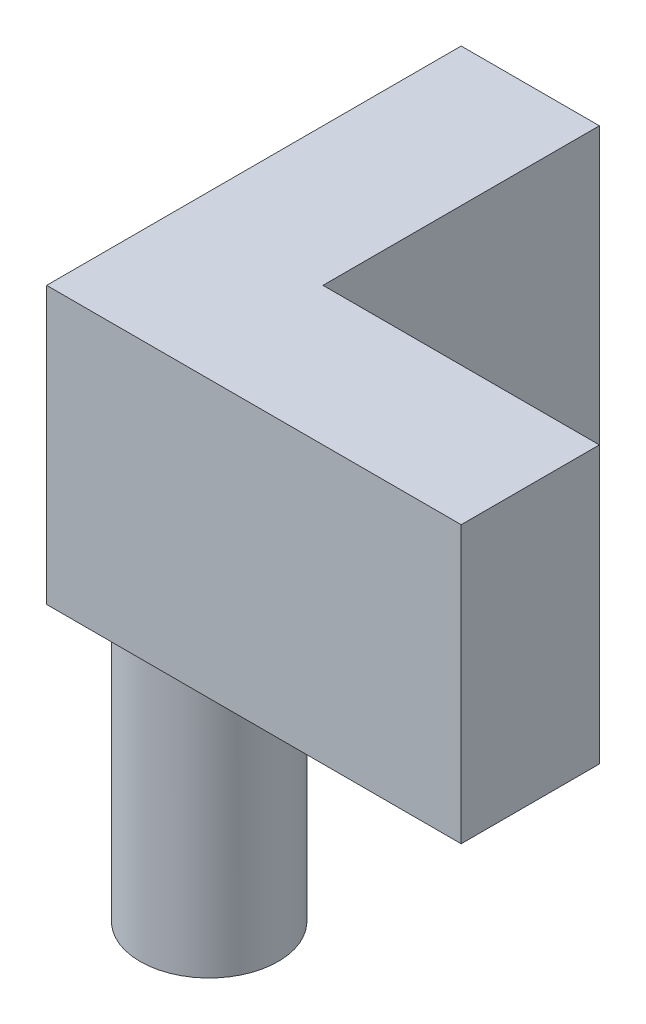
ISO-10303-21;
HEADER;
FILE_DESCRIPTION(('STEP AP214'),'2;1');
FILE_NAME('part.step','',(''),(''),'','','');
FILE_SCHEMA(('AUTOMOTIVE_DESIGN { 1 0 10303 214 1 1 1 1 }'));
ENDSEC;
DATA;
#1=APPLICATION_CONTEXT('core data for automotive mechanical design processes');
#2=APPLICATION_PROTOCOL_DEFINITION('international standard','automotive_design',2000,#1);
#3=PRODUCT_CONTEXT('',#1,'mechanical');
#4=PRODUCT('Part','Part','',(#3));
#5=PRODUCT_RELATED_PRODUCT_CATEGORY('part','',(#4));
#6=PRODUCT_DEFINITION_FORMATION('','',#4);
#7=PRODUCT_DEFINITION_CONTEXT('part definition',#1,'design');
#8=PRODUCT_DEFINITION('design','',#6,#7);
#9=PRODUCT_DEFINITION_SHAPE('','',#8);
#10=(LENGTH_UNIT() NAMED_UNIT(*) SI_UNIT(.MILLI.,.METRE.));
#11=(NAMED_UNIT(*) PLANE_ANGLE_UNIT() SI_UNIT($,.RADIAN.));
#12=(NAMED_UNIT(*) SI_UNIT($,.STERADIAN.) SOLID_ANGLE_UNIT());
#13=UNCERTAINTY_MEASURE_WITH_UNIT(LENGTH_MEASURE(1.E-05),#10,'distance_accuracy_value','');
#14=(GEOMETRIC_REPRESENTATION_CONTEXT(3) GLOBAL_UNCERTAINTY_ASSIGNED_CONTEXT((#13)) GLOBAL_UNIT_ASSIGNED_CONTEXT((#10,
#11,#12)) REPRESENTATION_CONTEXT('',''));
#15=CARTESIAN_POINT('',(0.,0.,0.));
#16=DIRECTION('',(0.,0.,1.));
#17=DIRECTION('',(1.,0.,0.));
#18=AXIS2_PLACEMENT_3D('',#15,#16,#17);
#19=CARTESIAN_POINT('',(0.,10.,0.));
#20=DIRECTION('',(0.,-1.,0.));
#21=DIRECTION('',(0.,0.,-1.));
#22=AXIS2_PLACEMENT_3D('',#19,#20,#21);
#23=PLANE('',#22);
#24=DIRECTION('',(0.,0.,-1.));
#25=VECTOR('',#24,1.);
#26=CARTESIAN_POINT('',(5.,10.,-5.));
#27=LINE('',#26,#25);
#28=CARTESIAN_POINT('',(5.,10.,-5.));
#29=VERTEX_POINT('',#28);
#30=CARTESIAN_POINT('',(5.,10.,-15.));
#31=VERTEX_POINT('',#30);
#32=EDGE_CURVE('E128',#29,#31,#27,.T.);
#33=ORIENTED_EDGE('',*,*,#32,.T.);
#34=DIRECTION('',(-1.,0.,0.));
#35=VECTOR('',#34,1.);
#36=CARTESIAN_POINT('',(0.,10.,-15.));
#37=LINE('',#36,#35);
#38=CARTESIAN_POINT('',(0.,10.,-15.));
#39=VERTEX_POINT('',#38);
#40=EDGE_CURVE('E87',#31,#39,#37,.T.);
#41=ORIENTED_EDGE('',*,*,#40,.T.);
#42=DIRECTION('',(0.,0.,1.));
#43=VECTOR('',#42,1.);
#44=CARTESIAN_POINT('',(0.,10.,-15.));
#45=LINE('',#44,#43);
#46=CARTESIAN_POINT('',(0.,10.,0.));
#47=VERTEX_POINT('',#46);
#48=EDGE_CURVE('E99',#39,#47,#45,.T.);
#49=ORIENTED_EDGE('',*,*,#48,.T.);
#50=DIRECTION('',(1.,0.,0.));
#51=VECTOR('',#50,1.);
#52=CARTESIAN_POINT('',(0.,10.,0.));
#53=LINE('',#52,#51);
#54=CARTESIAN_POINT('',(15.,10.,0.));
#55=VERTEX_POINT('',#54);
#56=EDGE_CURVE('E94',#47,#55,#53,.T.);
#57=ORIENTED_EDGE('',*,*,#56,.T.);
#58=DIRECTION('',(0.,0.,-1.));
#59=VECTOR('',#58,1.);
#60=CARTESIAN_POINT('',(15.,10.,0.));
#61=LINE('',#60,#59);
#62=CARTESIAN_POINT('',(15.,10.,-5.));
#63=VERTEX_POINT('',#62);
#64=EDGE_CURVE('E97',#55,#63,#61,.T.);
#65=ORIENTED_EDGE('',*,*,#64,.T.);
#66=DIRECTION('',(-1.,0.,0.));
#67=VECTOR('',#66,1.);
#68=CARTESIAN_POINT('',(5.,10.,-5.));
#69=LINE('',#68,#67);
#70=EDGE_CURVE('E50',#63,#29,#69,.T.);
#71=ORIENTED_EDGE('',*,*,#70,.T.);
#72=EDGE_LOOP('',(#33,#41,#49,#57,#65,#71));
#73=FACE_BOUND('',#72,.T.);
#74=ADVANCED_FACE('F33',(#73),#23,.F.);
#75=CARTESIAN_POINT('',(0.,0.,0.));
#76=DIRECTION('',(0.,-1.,0.));
#77=DIRECTION('',(0.,0.,-1.));
#78=AXIS2_PLACEMENT_3D('',#75,#76,#77);
#79=PLANE('',#78);
#80=DIRECTION('',(0.,0.,-1.));
#81=VECTOR('',#80,1.);
#82=CARTESIAN_POINT('',(5.,0.,-5.));
#83=LINE('',#82,#81);
#84=CARTESIAN_POINT('',(5.,0.,-5.));
#85=VERTEX_POINT('',#84);
#86=CARTESIAN_POINT('',(5.,0.,-15.));
#87=VERTEX_POINT('',#86);
#88=EDGE_CURVE('E117',#85,#87,#83,.T.);
#89=ORIENTED_EDGE('',*,*,#88,.F.);
#90=DIRECTION('',(-1.,0.,0.));
#91=VECTOR('',#90,1.);
#92=CARTESIAN_POINT('',(5.,0.,-5.));
#93=LINE('',#92,#91);
#94=CARTESIAN_POINT('',(15.,0.,-5.));
#95=VERTEX_POINT('',#94);
#96=EDGE_CURVE('E79',#95,#85,#93,.T.);
#97=ORIENTED_EDGE('',*,*,#96,.F.);
#98=DIRECTION('',(0.,0.,-1.));
#99=VECTOR('',#98,1.);
#100=CARTESIAN_POINT('',(15.,0.,0.));
#101=LINE('',#100,#99);
#102=CARTESIAN_POINT('',(15.,0.,0.));
#103=VERTEX_POINT('',#102);
#104=EDGE_CURVE('E73',#103,#95,#101,.T.);
#105=ORIENTED_EDGE('',*,*,#104,.F.);
#106=DIRECTION('',(1.,0.,0.));
#107=VECTOR('',#106,1.);
#108=CARTESIAN_POINT('',(0.,0.,0.));
#109=LINE('',#108,#107);
#110=CARTESIAN_POINT('',(0.,0.,0.));
#111=VERTEX_POINT('',#110);
#112=EDGE_CURVE('E107',#111,#103,#109,.T.);
#113=ORIENTED_EDGE('',*,*,#112,.F.);
#114=DIRECTION('',(0.,0.,1.));
#115=VECTOR('',#114,1.);
#116=CARTESIAN_POINT('',(0.,0.,-15.));
#117=LINE('',#116,#115);
#118=CARTESIAN_POINT('',(0.,0.,-15.));
#119=VERTEX_POINT('',#118);
#120=EDGE_CURVE('E123',#119,#111,#117,.T.);
#121=ORIENTED_EDGE('',*,*,#120,.F.);
#122=DIRECTION('',(-1.,0.,0.));
#123=VECTOR('',#122,1.);
#124=CARTESIAN_POINT('',(0.,0.,-15.));
#125=LINE('',#124,#123);
#126=EDGE_CURVE('E120',#87,#119,#125,.T.);
#127=ORIENTED_EDGE('',*,*,#126,.F.);
#128=EDGE_LOOP('',(#89,#97,#105,#113,#121,#127));
#129=FACE_BOUND('',#128,.T.);
#130=CARTESIAN_POINT('',(2.87994854663509,0.,-3.00079319131008));
#131=DIRECTION('',(0.,-1.,0.));
#132=DIRECTION('',(0.,0.,-1.));
#133=AXIS2_PLACEMENT_3D('',#130,#131,#132);
#134=CIRCLE('',#133,2.5);
#135=CARTESIAN_POINT('',(2.87994854663509,0.,-5.50079319131008));
#136=VERTEX_POINT('',#135);
#137=EDGE_CURVE('E121',#136,#136,#134,.T.);
#138=ORIENTED_EDGE('',*,*,#137,.F.);
#139=EDGE_LOOP('',(#138));
#140=FACE_BOUND('',#139,.T.);
#141=ADVANCED_FACE('F137',(#129,#140),#79,.T.);
#142=CARTESIAN_POINT('',(5.,10.,-5.));
#143=DIRECTION('',(-1.,0.,0.));
#144=DIRECTION('',(0.,0.,1.));
#145=AXIS2_PLACEMENT_3D('',#142,#143,#144);
#146=PLANE('',#145);
#147=ORIENTED_EDGE('',*,*,#88,.T.);
#148=DIRECTION('',(0.,-1.,0.));
#149=VECTOR('',#148,1.);
#150=CARTESIAN_POINT('',(5.,10.,-15.));
#151=LINE('',#150,#149);
#152=EDGE_CURVE('E11',#31,#87,#151,.T.);
#153=ORIENTED_EDGE('',*,*,#152,.F.);
#154=ORIENTED_EDGE('',*,*,#32,.F.);
#155=DIRECTION('',(0.,-1.,0.));
#156=VECTOR('',#155,1.);
#157=CARTESIAN_POINT('',(5.,10.,-5.));
#158=LINE('',#157,#156);
#159=EDGE_CURVE('E113',#29,#85,#158,.T.);
#160=ORIENTED_EDGE('',*,*,#159,.T.);
#161=EDGE_LOOP('',(#147,#153,#154,#160));
#162=FACE_BOUND('',#161,.T.);
#163=ADVANCED_FACE('F35',(#162),#146,.F.);
#164=CARTESIAN_POINT('',(0.,10.,-15.));
#165=DIRECTION('',(0.,0.,1.));
#166=DIRECTION('',(1.,0.,0.));
#167=AXIS2_PLACEMENT_3D('',#164,#165,#166);
#168=PLANE('',#167);
#169=ORIENTED_EDGE('',*,*,#126,.T.);
#170=DIRECTION('',(0.,-1.,0.));
#171=VECTOR('',#170,1.);
#172=CARTESIAN_POINT('',(0.,10.,-15.));
#173=LINE('',#172,#171);
#174=EDGE_CURVE('E42',#39,#119,#173,.T.);
#175=ORIENTED_EDGE('',*,*,#174,.F.);
#176=ORIENTED_EDGE('',*,*,#40,.F.);
#177=ORIENTED_EDGE('',*,*,#152,.T.);
#178=EDGE_LOOP('',(#169,#175,#176,#177));
#179=FACE_BOUND('',#178,.T.);
#180=ADVANCED_FACE('F211',(#179),#168,.F.);
#181=CARTESIAN_POINT('',(0.,10.,-15.));
#182=DIRECTION('',(1.,0.,0.));
#183=DIRECTION('',(0.,0.,-1.));
#184=AXIS2_PLACEMENT_3D('',#181,#182,#183);
#185=PLANE('',#184);
#186=ORIENTED_EDGE('',*,*,#120,.T.);
#187=DIRECTION('',(0.,-1.,0.));
#188=VECTOR('',#187,1.);
#189=CARTESIAN_POINT('',(0.,10.,0.));
#190=LINE('',#189,#188);
#191=EDGE_CURVE('E108',#47,#111,#190,.T.);
#192=ORIENTED_EDGE('',*,*,#191,.F.);
#193=ORIENTED_EDGE('',*,*,#48,.F.);
#194=ORIENTED_EDGE('',*,*,#174,.T.);
#195=EDGE_LOOP('',(#186,#192,#193,#194));
#196=FACE_BOUND('',#195,.T.);
#197=ADVANCED_FACE('F134',(#196),#185,.F.);
#198=CARTESIAN_POINT('',(0.,10.,0.));
#199=DIRECTION('',(0.,0.,-1.));
#200=DIRECTION('',(-1.,0.,0.));
#201=AXIS2_PLACEMENT_3D('',#198,#199,#200);
#202=PLANE('',#201);
#203=ORIENTED_EDGE('',*,*,#112,.T.);
#204=DIRECTION('',(0.,-1.,0.));
#205=VECTOR('',#204,1.);
#206=CARTESIAN_POINT('',(15.,10.,0.));
#207=LINE('',#206,#205);
#208=EDGE_CURVE('E104',#55,#103,#207,.T.);
#209=ORIENTED_EDGE('',*,*,#208,.F.);
#210=ORIENTED_EDGE('',*,*,#56,.F.);
#211=ORIENTED_EDGE('',*,*,#191,.T.);
#212=EDGE_LOOP('',(#203,#209,#210,#211));
#213=FACE_BOUND('',#212,.T.);
#214=ADVANCED_FACE('F105',(#213),#202,.F.);
#215=CARTESIAN_POINT('',(15.,10.,0.));
#216=DIRECTION('',(-1.,0.,0.));
#217=DIRECTION('',(0.,0.,1.));
#218=AXIS2_PLACEMENT_3D('',#215,#216,#217);
#219=PLANE('',#218);
#220=ORIENTED_EDGE('',*,*,#104,.T.);
#221=DIRECTION('',(0.,-1.,0.));
#222=VECTOR('',#221,1.);
#223=CARTESIAN_POINT('',(15.,10.,-5.));
#224=LINE('',#223,#222);
#225=EDGE_CURVE('E109',#63,#95,#224,.T.);
#226=ORIENTED_EDGE('',*,*,#225,.F.);
#227=ORIENTED_EDGE('',*,*,#64,.F.);
#228=ORIENTED_EDGE('',*,*,#208,.T.);
#229=EDGE_LOOP('',(#220,#226,#227,#228));
#230=FACE_BOUND('',#229,.T.);
#231=ADVANCED_FACE('F111',(#230),#219,.F.);
#232=CARTESIAN_POINT('',(5.,10.,-5.));
#233=DIRECTION('',(0.,0.,1.));
#234=DIRECTION('',(1.,0.,0.));
#235=AXIS2_PLACEMENT_3D('',#232,#233,#234);
#236=PLANE('',#235);
#237=ORIENTED_EDGE('',*,*,#96,.T.);
#238=ORIENTED_EDGE('',*,*,#159,.F.);
#239=ORIENTED_EDGE('',*,*,#70,.F.);
#240=ORIENTED_EDGE('',*,*,#225,.T.);
#241=EDGE_LOOP('',(#237,#238,#239,#240));
#242=FACE_BOUND('',#241,.T.);
#243=ADVANCED_FACE('F142',(#242),#236,.F.);
#244=CARTESIAN_POINT('',(2.87994854663509,-10.,-3.00079319131008));
#245=DIRECTION('',(0.,1.,0.));
#246=DIRECTION('',(0.,0.,1.));
#247=AXIS2_PLACEMENT_3D('',#244,#245,#246);
#248=CYLINDRICAL_SURFACE('',#247,2.5);
#249=ORIENTED_EDGE('',*,*,#137,.T.);
#250=EDGE_LOOP('',(#249));
#251=FACE_BOUND('',#250,.T.);
#252=CARTESIAN_POINT('',(2.87994854663509,-10.,-3.00079319131008));
#253=DIRECTION('',(0.,1.,0.));
#254=DIRECTION('',(0.,0.,1.));
#255=AXIS2_PLACEMENT_3D('',#252,#253,#254);
#256=CIRCLE('',#255,2.5);
#257=CARTESIAN_POINT('',(2.87994854663509,-10.,-0.50079319131008));
#258=VERTEX_POINT('',#257);
#259=EDGE_CURVE('E167',#258,#258,#256,.T.);
#260=ORIENTED_EDGE('',*,*,#259,.T.);
#261=EDGE_LOOP('',(#260));
#262=FACE_BOUND('',#261,.T.);
#263=ADVANCED_FACE('F144',(#251,#262),#248,.T.);
#264=CARTESIAN_POINT('',(2.87994854663509,-10.,-3.00079319131008));
#265=DIRECTION('',(0.,1.,0.));
#266=DIRECTION('',(0.,0.,1.));
#267=AXIS2_PLACEMENT_3D('',#264,#265,#266);
#268=PLANE('',#267);
#269=ORIENTED_EDGE('',*,*,#259,.F.);
#270=EDGE_LOOP('',(#269));
#271=FACE_BOUND('',#270,.T.);
#272=ADVANCED_FACE('F151',(#271),#268,.F.);
#273=CLOSED_SHELL('',(#74,#141,#163,#180,#197,#214,#231,#243,#263,#272));
#274=MANIFOLD_SOLID_BREP('B2',#273);
#275=ADVANCED_BREP_SHAPE_REPRESENTATION('',(#18,#274),#14);
#276=SHAPE_DEFINITION_REPRESENTATION(#9,#275);
ENDSEC;
END-ISO-10303-21;
